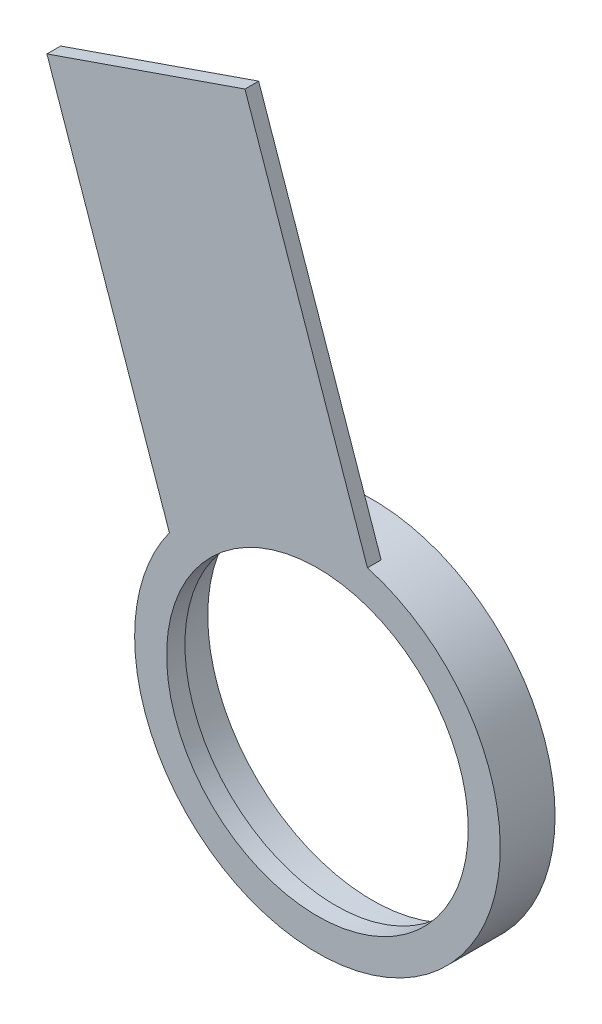
ISO-10303-21;
HEADER;
FILE_DESCRIPTION(('STEP AP214'),'2;1');
FILE_NAME('part.step','',(''),(''),'','','');
FILE_SCHEMA(('AUTOMOTIVE_DESIGN { 1 0 10303 214 1 1 1 1 }'));
ENDSEC;
DATA;
#1=APPLICATION_CONTEXT('core data for automotive mechanical design processes');
#2=APPLICATION_PROTOCOL_DEFINITION('international standard','automotive_design',2000,#1);
#3=PRODUCT_CONTEXT('',#1,'mechanical');
#4=PRODUCT('Part','Part','',(#3));
#5=PRODUCT_RELATED_PRODUCT_CATEGORY('part','',(#4));
#6=PRODUCT_DEFINITION_FORMATION('','',#4);
#7=PRODUCT_DEFINITION_CONTEXT('part definition',#1,'design');
#8=PRODUCT_DEFINITION('design','',#6,#7);
#9=PRODUCT_DEFINITION_SHAPE('','',#8);
#10=(LENGTH_UNIT() NAMED_UNIT(*) SI_UNIT(.MILLI.,.METRE.));
#11=(NAMED_UNIT(*) PLANE_ANGLE_UNIT() SI_UNIT($,.RADIAN.));
#12=(NAMED_UNIT(*) SI_UNIT($,.STERADIAN.) SOLID_ANGLE_UNIT());
#13=UNCERTAINTY_MEASURE_WITH_UNIT(LENGTH_MEASURE(1.E-05),#10,'distance_accuracy_value','');
#14=(GEOMETRIC_REPRESENTATION_CONTEXT(3) GLOBAL_UNCERTAINTY_ASSIGNED_CONTEXT((#13)) GLOBAL_UNIT_ASSIGNED_CONTEXT((#10,
#11,#12)) REPRESENTATION_CONTEXT('',''));
#15=CARTESIAN_POINT('',(0.,0.,0.));
#16=DIRECTION('',(0.,0.,1.));
#17=DIRECTION('',(1.,0.,0.));
#18=AXIS2_PLACEMENT_3D('',#15,#16,#17);
#19=CARTESIAN_POINT('',(-86.606649797073,-63.7835303855202,0.));
#20=DIRECTION('',(0.,0.,1.));
#21=DIRECTION('',(1.,0.,0.));
#22=AXIS2_PLACEMENT_3D('',#19,#20,#21);
#23=PLANE('',#22);
#24=CARTESIAN_POINT('',(-86.606649797073,-63.7835303855202,0.));
#25=DIRECTION('',(0.,0.,1.));
#26=DIRECTION('',(1.,0.,0.));
#27=AXIS2_PLACEMENT_3D('',#24,#25,#26);
#28=CIRCLE('',#27,32.9999999999998);
#29=CARTESIAN_POINT('',(-53.6066497970732,-63.7835303855202,0.));
#30=VERTEX_POINT('',#29);
#31=EDGE_CURVE('E116',#30,#30,#28,.T.);
#32=ORIENTED_EDGE('',*,*,#31,.T.);
#33=EDGE_LOOP('',(#32));
#34=FACE_BOUND('',#33,.T.);
#35=CARTESIAN_POINT('',(-86.6066497970745,-63.7835303855214,0.));
#36=DIRECTION('',(0.,0.,-1.));
#37=DIRECTION('',(-1.,0.,0.));
#38=AXIS2_PLACEMENT_3D('',#35,#36,#37);
#39=CIRCLE('',#38,36.0000000000021);
#40=CARTESIAN_POINT('',(-122.606649797077,-63.7835303855214,0.));
#41=VERTEX_POINT('',#40);
#42=EDGE_CURVE('E106',#41,#41,#39,.T.);
#43=ORIENTED_EDGE('',*,*,#42,.T.);
#44=EDGE_LOOP('',(#43));
#45=FACE_BOUND('',#44,.T.);
#46=ADVANCED_FACE('F39',(#34,#45),#23,.F.);
#47=CARTESIAN_POINT('',(-86.606649797073,-63.7835303855202,4.));
#48=DIRECTION('',(0.,0.,1.));
#49=DIRECTION('',(1.,0.,0.));
#50=AXIS2_PLACEMENT_3D('',#47,#48,#49);
#51=PLANE('',#50);
#52=CARTESIAN_POINT('',(-86.606649797073,-63.7835303855202,4.));
#53=DIRECTION('',(0.,0.,1.));
#54=DIRECTION('',(1.,0.,0.));
#55=AXIS2_PLACEMENT_3D('',#52,#53,#54);
#56=CIRCLE('',#55,40.);
#57=CARTESIAN_POINT('',(-119.004205290731,-40.3229592493491,4.));
#58=VERTEX_POINT('',#57);
#59=CARTESIAN_POINT('',(-75.6723049719823,-25.3070427177767,4.));
#60=VERTEX_POINT('',#59);
#61=EDGE_CURVE('E120',#58,#60,#56,.T.);
#62=ORIENTED_EDGE('',*,*,#61,.T.);
#63=DIRECTION('',(-0.327430136032445,0.944875391793952,0.));
#64=VECTOR('',#63,1.);
#65=CARTESIAN_POINT('',(-102.470674132793,52.0258499324921,4.));
#66=LINE('',#65,#64);
#67=CARTESIAN_POINT('',(-102.470674132793,52.0258499324921,4.));
#68=VERTEX_POINT('',#67);
#69=EDGE_CURVE('E102',#60,#68,#66,.T.);
#70=ORIENTED_EDGE('',*,*,#69,.T.);
#71=DIRECTION('',(-0.944875391793953,-0.327430136032443,0.));
#72=VECTOR('',#71,1.);
#73=CARTESIAN_POINT('',(-102.470674132793,52.0258499324921,4.));
#74=LINE('',#73,#72);
#75=CARTESIAN_POINT('',(-145.802574451543,37.0099334009222,4.));
#76=VERTEX_POINT('',#75);
#77=EDGE_CURVE('E94',#68,#76,#74,.T.);
#78=ORIENTED_EDGE('',*,*,#77,.T.);
#79=DIRECTION('',(0.327430136032443,-0.944875391793953,0.));
#80=VECTOR('',#79,1.);
#81=CARTESIAN_POINT('',(-145.802574451543,37.0099334009222,4.));
#82=LINE('',#81,#80);
#83=EDGE_CURVE('E54',#76,#58,#82,.T.);
#84=ORIENTED_EDGE('',*,*,#83,.T.);
#85=EDGE_LOOP('',(#62,#70,#78,#84));
#86=FACE_BOUND('',#85,.T.);
#87=CARTESIAN_POINT('',(-86.606649797073,-63.7835303855202,4.));
#88=DIRECTION('',(0.,0.,1.));
#89=DIRECTION('',(1.,0.,0.));
#90=AXIS2_PLACEMENT_3D('',#87,#88,#89);
#91=CIRCLE('',#90,32.9999999999998);
#92=CARTESIAN_POINT('',(-53.6066497970732,-63.7835303855202,4.));
#93=VERTEX_POINT('',#92);
#94=EDGE_CURVE('E117',#93,#93,#91,.T.);
#95=ORIENTED_EDGE('',*,*,#94,.F.);
#96=EDGE_LOOP('',(#95));
#97=FACE_BOUND('',#96,.T.);
#98=ADVANCED_FACE('F130',(#86,#97),#51,.T.);
#99=CARTESIAN_POINT('',(-86.606649797073,-63.7835303855202,4.));
#100=DIRECTION('',(0.,0.,-1.));
#101=DIRECTION('',(-1.,0.,0.));
#102=AXIS2_PLACEMENT_3D('',#99,#100,#101);
#103=CYLINDRICAL_SURFACE('',#102,40.);
#104=CARTESIAN_POINT('',(-86.606649797073,-63.7835303855202,1.));
#105=DIRECTION('',(0.,0.,-1.));
#106=DIRECTION('',(-1.,0.,0.));
#107=AXIS2_PLACEMENT_3D('',#104,#105,#106);
#108=CIRCLE('',#107,40.);
#109=CARTESIAN_POINT('',(-119.004205290731,-40.3229592493491,1.));
#110=VERTEX_POINT('',#109);
#111=CARTESIAN_POINT('',(-75.6723049719823,-25.3070427177767,1.));
#112=VERTEX_POINT('',#111);
#113=EDGE_CURVE('E62',#110,#112,#108,.T.);
#114=ORIENTED_EDGE('',*,*,#113,.T.);
#115=DIRECTION('',(0.,0.,-1.));
#116=VECTOR('',#115,1.);
#117=CARTESIAN_POINT('',(-75.6723049719823,-25.3070427177767,4.));
#118=LINE('',#117,#116);
#119=EDGE_CURVE('E11',#112,#60,#118,.F.);
#120=ORIENTED_EDGE('',*,*,#119,.T.);
#121=ORIENTED_EDGE('',*,*,#61,.F.);
#122=DIRECTION('',(0.,0.,-1.));
#123=VECTOR('',#122,1.);
#124=CARTESIAN_POINT('',(-119.004205290731,-40.3229592493491,4.));
#125=LINE('',#124,#123);
#126=EDGE_CURVE('E47',#58,#110,#125,.T.);
#127=ORIENTED_EDGE('',*,*,#126,.T.);
#128=EDGE_LOOP('',(#114,#120,#121,#127));
#129=FACE_BOUND('',#128,.T.);
#130=CARTESIAN_POINT('',(-86.6066497970745,-63.7835303855214,-8.));
#131=DIRECTION('',(0.,0.,-1.));
#132=DIRECTION('',(-1.,0.,0.));
#133=AXIS2_PLACEMENT_3D('',#130,#131,#132);
#134=CIRCLE('',#133,40.0000000000014);
#135=CARTESIAN_POINT('',(-126.606649797076,-63.7835303855214,-8.));
#136=VERTEX_POINT('',#135);
#137=EDGE_CURVE('E111',#136,#136,#134,.T.);
#138=ORIENTED_EDGE('',*,*,#137,.F.);
#139=EDGE_LOOP('',(#138));
#140=FACE_BOUND('',#139,.T.);
#141=ADVANCED_FACE('F41',(#129,#140),#103,.T.);
#142=CARTESIAN_POINT('',(-86.606649797073,-63.7835303855202,4.));
#143=DIRECTION('',(0.,0.,-1.));
#144=DIRECTION('',(-1.,0.,0.));
#145=AXIS2_PLACEMENT_3D('',#142,#143,#144);
#146=CYLINDRICAL_SURFACE('',#145,32.9999999999998);
#147=ORIENTED_EDGE('',*,*,#94,.T.);
#148=EDGE_LOOP('',(#147));
#149=FACE_BOUND('',#148,.T.);
#150=ORIENTED_EDGE('',*,*,#31,.F.);
#151=EDGE_LOOP('',(#150));
#152=FACE_BOUND('',#151,.T.);
#153=ADVANCED_FACE('F136',(#149,#152),#146,.F.);
#154=CARTESIAN_POINT('',(-86.6066497970745,-63.7835303855214,-8.));
#155=DIRECTION('',(0.,0.,-1.));
#156=DIRECTION('',(-1.,0.,0.));
#157=AXIS2_PLACEMENT_3D('',#154,#155,#156);
#158=PLANE('',#157);
#159=ORIENTED_EDGE('',*,*,#137,.T.);
#160=EDGE_LOOP('',(#159));
#161=FACE_BOUND('',#160,.T.);
#162=CARTESIAN_POINT('',(-86.6066497970745,-63.7835303855214,-8.));
#163=DIRECTION('',(0.,0.,-1.));
#164=DIRECTION('',(-1.,0.,0.));
#165=AXIS2_PLACEMENT_3D('',#162,#163,#164);
#166=CIRCLE('',#165,36.0000000000021);
#167=CARTESIAN_POINT('',(-122.606649797077,-63.7835303855214,-8.));
#168=VERTEX_POINT('',#167);
#169=EDGE_CURVE('E108',#168,#168,#166,.T.);
#170=ORIENTED_EDGE('',*,*,#169,.F.);
#171=EDGE_LOOP('',(#170));
#172=FACE_BOUND('',#171,.T.);
#173=ADVANCED_FACE('F139',(#161,#172),#158,.T.);
#174=CARTESIAN_POINT('',(-86.6066497970745,-63.7835303855214,-8.));
#175=DIRECTION('',(0.,0.,1.));
#176=DIRECTION('',(1.,0.,0.));
#177=AXIS2_PLACEMENT_3D('',#174,#175,#176);
#178=CYLINDRICAL_SURFACE('',#177,36.0000000000021);
#179=ORIENTED_EDGE('',*,*,#169,.T.);
#180=EDGE_LOOP('',(#179));
#181=FACE_BOUND('',#180,.T.);
#182=ORIENTED_EDGE('',*,*,#42,.F.);
#183=EDGE_LOOP('',(#182));
#184=FACE_BOUND('',#183,.T.);
#185=ADVANCED_FACE('F147',(#181,#184),#178,.F.);
#186=CARTESIAN_POINT('',(-102.470674132793,52.0258499324921,1.));
#187=DIRECTION('',(0.944875391793952,0.327430136032445,0.));
#188=DIRECTION('',(-0.327430136032445,0.944875391793952,0.));
#189=AXIS2_PLACEMENT_3D('',#186,#187,#188);
#190=PLANE('',#189);
#191=ORIENTED_EDGE('',*,*,#119,.F.);
#192=DIRECTION('',(-0.327430136032445,0.944875391793952,0.));
#193=VECTOR('',#192,1.);
#194=CARTESIAN_POINT('',(-102.470674132793,52.0258499324921,1.));
#195=LINE('',#194,#193);
#196=CARTESIAN_POINT('',(-102.470674132793,52.0258499324921,1.));
#197=VERTEX_POINT('',#196);
#198=EDGE_CURVE('E83',#112,#197,#195,.T.);
#199=ORIENTED_EDGE('',*,*,#198,.T.);
#200=DIRECTION('',(0.,0.,1.));
#201=VECTOR('',#200,1.);
#202=CARTESIAN_POINT('',(-102.470674132793,52.0258499324921,1.));
#203=LINE('',#202,#201);
#204=EDGE_CURVE('E86',#197,#68,#203,.T.);
#205=ORIENTED_EDGE('',*,*,#204,.T.);
#206=ORIENTED_EDGE('',*,*,#69,.F.);
#207=EDGE_LOOP('',(#191,#199,#205,#206));
#208=FACE_BOUND('',#207,.T.);
#209=ADVANCED_FACE('F85',(#208),#190,.T.);
#210=CARTESIAN_POINT('',(-145.802574451543,37.0099334009222,1.));
#211=DIRECTION('',(-0.944875391793953,-0.327430136032443,0.));
#212=DIRECTION('',(0.327430136032443,-0.944875391793953,0.));
#213=AXIS2_PLACEMENT_3D('',#210,#211,#212);
#214=PLANE('',#213);
#215=ORIENTED_EDGE('',*,*,#126,.F.);
#216=ORIENTED_EDGE('',*,*,#83,.F.);
#217=DIRECTION('',(0.,0.,1.));
#218=VECTOR('',#217,1.);
#219=CARTESIAN_POINT('',(-145.802574451543,37.0099334009222,1.));
#220=LINE('',#219,#218);
#221=CARTESIAN_POINT('',(-145.802574451543,37.0099334009222,1.));
#222=VERTEX_POINT('',#221);
#223=EDGE_CURVE('E95',#222,#76,#220,.T.);
#224=ORIENTED_EDGE('',*,*,#223,.F.);
#225=DIRECTION('',(0.327430136032443,-0.944875391793953,0.));
#226=VECTOR('',#225,1.);
#227=CARTESIAN_POINT('',(-145.802574451543,37.0099334009222,1.));
#228=LINE('',#227,#226);
#229=EDGE_CURVE('E96',#222,#110,#228,.T.);
#230=ORIENTED_EDGE('',*,*,#229,.T.);
#231=EDGE_LOOP('',(#215,#216,#224,#230));
#232=FACE_BOUND('',#231,.T.);
#233=ADVANCED_FACE('F129',(#232),#214,.T.);
#234=CARTESIAN_POINT('',(-102.470674132793,52.0258499324921,1.));
#235=DIRECTION('',(-0.327430136032443,0.944875391793953,0.));
#236=DIRECTION('',(-0.944875391793953,-0.327430136032443,0.));
#237=AXIS2_PLACEMENT_3D('',#234,#235,#236);
#238=PLANE('',#237);
#239=ORIENTED_EDGE('',*,*,#77,.F.);
#240=ORIENTED_EDGE('',*,*,#204,.F.);
#241=DIRECTION('',(-0.944875391793953,-0.327430136032443,0.));
#242=VECTOR('',#241,1.);
#243=CARTESIAN_POINT('',(-102.470674132793,52.0258499324921,1.));
#244=LINE('',#243,#242);
#245=EDGE_CURVE('E89',#197,#222,#244,.T.);
#246=ORIENTED_EDGE('',*,*,#245,.T.);
#247=ORIENTED_EDGE('',*,*,#223,.T.);
#248=EDGE_LOOP('',(#239,#240,#246,#247));
#249=FACE_BOUND('',#248,.T.);
#250=ADVANCED_FACE('F93',(#249),#238,.T.);
#251=CARTESIAN_POINT('',(-86.6066497970745,-63.7835303855214,1.));
#252=DIRECTION('',(0.,0.,-1.));
#253=DIRECTION('',(-1.,0.,0.));
#254=AXIS2_PLACEMENT_3D('',#251,#252,#253);
#255=PLANE('',#254);
#256=ORIENTED_EDGE('',*,*,#113,.F.);
#257=ORIENTED_EDGE('',*,*,#229,.F.);
#258=ORIENTED_EDGE('',*,*,#245,.F.);
#259=ORIENTED_EDGE('',*,*,#198,.F.);
#260=EDGE_LOOP('',(#256,#257,#258,#259));
#261=FACE_BOUND('',#260,.T.);
#262=ADVANCED_FACE('F98',(#261),#255,.T.);
#263=CLOSED_SHELL('',(#46,#98,#141,#153,#173,#185,#209,#233,#250,#262));
#264=MANIFOLD_SOLID_BREP('B2',#263);
#265=ADVANCED_BREP_SHAPE_REPRESENTATION('',(#18,#264),#14);
#266=SHAPE_DEFINITION_REPRESENTATION(#9,#265);
ENDSEC;
END-ISO-10303-21;
